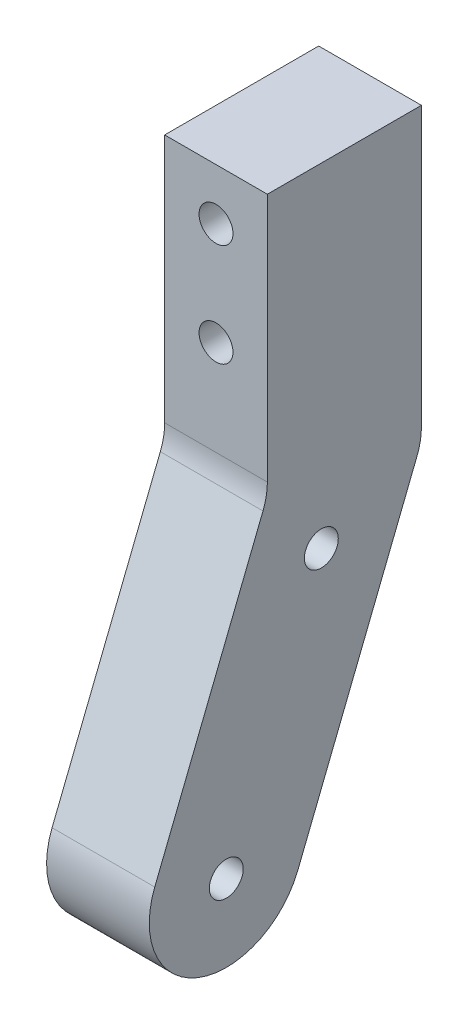
ISO-10303-21;
HEADER;
FILE_DESCRIPTION(('STEP AP214'),'2;1');
FILE_NAME('part.step','',(''),(''),'','','');
FILE_SCHEMA(('AUTOMOTIVE_DESIGN { 1 0 10303 214 1 1 1 1 }'));
ENDSEC;
DATA;
#1=APPLICATION_CONTEXT('core data for automotive mechanical design processes');
#2=APPLICATION_PROTOCOL_DEFINITION('international standard','automotive_design',2000,#1);
#3=PRODUCT_CONTEXT('',#1,'mechanical');
#4=PRODUCT('Part','Part','',(#3));
#5=PRODUCT_RELATED_PRODUCT_CATEGORY('part','',(#4));
#6=PRODUCT_DEFINITION_FORMATION('','',#4);
#7=PRODUCT_DEFINITION_CONTEXT('part definition',#1,'design');
#8=PRODUCT_DEFINITION('design','',#6,#7);
#9=PRODUCT_DEFINITION_SHAPE('','',#8);
#10=(LENGTH_UNIT() NAMED_UNIT(*) SI_UNIT(.MILLI.,.METRE.));
#11=(NAMED_UNIT(*) PLANE_ANGLE_UNIT() SI_UNIT($,.RADIAN.));
#12=(NAMED_UNIT(*) SI_UNIT($,.STERADIAN.) SOLID_ANGLE_UNIT());
#13=UNCERTAINTY_MEASURE_WITH_UNIT(LENGTH_MEASURE(1.E-05),#10,'distance_accuracy_value','');
#14=(GEOMETRIC_REPRESENTATION_CONTEXT(3) GLOBAL_UNCERTAINTY_ASSIGNED_CONTEXT((#13)) GLOBAL_UNIT_ASSIGNED_CONTEXT((#10,
#11,#12)) REPRESENTATION_CONTEXT('',''));
#15=CARTESIAN_POINT('',(0.,0.,0.));
#16=DIRECTION('',(0.,0.,1.));
#17=DIRECTION('',(1.,0.,0.));
#18=AXIS2_PLACEMENT_3D('',#15,#16,#17);
#19=CARTESIAN_POINT('',(10.,0.,0.));
#20=DIRECTION('',(-1.,0.,0.));
#21=DIRECTION('',(0.,0.,1.));
#22=AXIS2_PLACEMENT_3D('',#19,#20,#21);
#23=PLANE('',#22);
#24=CARTESIAN_POINT('',(10.,-23.2234711307508,9.25582998110832));
#25=DIRECTION('',(1.,0.,0.));
#26=DIRECTION('',(0.,0.,-1.));
#27=AXIS2_PLACEMENT_3D('',#24,#25,#26);
#28=CIRCLE('',#27,1.65);
#29=CARTESIAN_POINT('',(10.,-23.2234711307508,7.60582998110832));
#30=VERTEX_POINT('',#29);
#31=EDGE_CURVE('E194',#30,#30,#28,.T.);
#32=ORIENTED_EDGE('',*,*,#31,.F.);
#33=EDGE_LOOP('',(#32));
#34=FACE_BOUND('',#33,.T.);
#35=CARTESIAN_POINT('',(10.,0.,0.));
#36=DIRECTION('',(1.,0.,0.));
#37=DIRECTION('',(0.,0.,-1.));
#38=AXIS2_PLACEMENT_3D('',#35,#36,#37);
#39=CIRCLE('',#38,1.65);
#40=CARTESIAN_POINT('',(10.,0.,-1.65));
#41=VERTEX_POINT('',#40);
#42=EDGE_CURVE('E123',#41,#41,#39,.T.);
#43=ORIENTED_EDGE('',*,*,#42,.F.);
#44=EDGE_LOOP('',(#43));
#45=FACE_BOUND('',#44,.T.);
#46=DIRECTION('',(0.,0.928938845230033,-0.370233199244333));
#47=VECTOR('',#46,1.);
#48=CARTESIAN_POINT('',(10.,-2.77674899433249,-6.96704133922524));
#49=LINE('',#48,#47);
#50=CARTESIAN_POINT('',(10.,-26.0002201250833,2.28878864188308));
#51=VERTEX_POINT('',#50);
#52=CARTESIAN_POINT('',(10.,3.12051037200447,-9.31742340493795));
#53=VERTEX_POINT('',#52);
#54=EDGE_CURVE('E207',#51,#53,#49,.T.);
#55=ORIENTED_EDGE('',*,*,#54,.T.);
#56=CARTESIAN_POINT('',(10.,5.34190956747047,-3.74379033355775));
#57=DIRECTION('',(-1.,0.,0.));
#58=DIRECTION('',(0.,0.,1.));
#59=AXIS2_PLACEMENT_3D('',#56,#57,#58);
#60=CIRCLE('',#59,6.);
#61=CARTESIAN_POINT('',(10.,5.34190956747047,-9.74379033355775));
#62=VERTEX_POINT('',#61);
#63=EDGE_CURVE('E142',#53,#62,#60,.F.);
#64=ORIENTED_EDGE('',*,*,#63,.T.);
#65=DIRECTION('',(0.,1.,0.));
#66=VECTOR('',#65,1.);
#67=CARTESIAN_POINT('',(10.,0.,-9.74379033355775));
#68=LINE('',#67,#66);
#69=CARTESIAN_POINT('',(10.,32.5,-9.74379033355775));
#70=VERTEX_POINT('',#69);
#71=EDGE_CURVE('E209',#62,#70,#68,.T.);
#72=ORIENTED_EDGE('',*,*,#71,.T.);
#73=DIRECTION('',(0.,0.,1.));
#74=VECTOR('',#73,1.);
#75=CARTESIAN_POINT('',(10.,32.5,32.2473639339157));
#76=LINE('',#75,#74);
#77=CARTESIAN_POINT('',(10.,32.5,5.25620966644225));
#78=VERTEX_POINT('',#77);
#79=EDGE_CURVE('E122',#70,#78,#76,.T.);
#80=ORIENTED_EDGE('',*,*,#79,.T.);
#81=DIRECTION('',(0.,1.,0.));
#82=VECTOR('',#81,1.);
#83=CARTESIAN_POINT('',(10.,0.,5.25620966644224));
#84=LINE('',#83,#82);
#85=CARTESIAN_POINT('',(10.,8.22095262391465,5.25620966644224));
#86=VERTEX_POINT('',#85);
#87=EDGE_CURVE('E112',#86,#78,#84,.T.);
#88=ORIENTED_EDGE('',*,*,#87,.F.);
#89=CARTESIAN_POINT('',(10.,8.22095262391465,11.2562096664422));
#90=DIRECTION('',(-1.,0.,0.));
#91=DIRECTION('',(0.,0.,1.));
#92=AXIS2_PLACEMENT_3D('',#89,#90,#91);
#93=CIRCLE('',#92,6.);
#94=CARTESIAN_POINT('',(10.,5.99955342844866,5.68257659506205));
#95=VERTEX_POINT('',#94);
#96=EDGE_CURVE('E41',#86,#95,#93,.T.);
#97=ORIENTED_EDGE('',*,*,#96,.T.);
#98=DIRECTION('',(0.,0.928938845230033,-0.370233199244332));
#99=VECTOR('',#98,1.);
#100=CARTESIAN_POINT('',(10.,2.77674899433249,6.96704133922524));
#101=LINE('',#100,#99);
#102=CARTESIAN_POINT('',(10.,-20.4467221364183,16.2228713203335));
#103=VERTEX_POINT('',#102);
#104=EDGE_CURVE('E139',#103,#95,#101,.T.);
#105=ORIENTED_EDGE('',*,*,#104,.F.);
#106=CARTESIAN_POINT('',(10.,-23.2234711307508,9.25582998110832));
#107=DIRECTION('',(1.,0.,0.));
#108=DIRECTION('',(0.,0.,-1.));
#109=AXIS2_PLACEMENT_3D('',#106,#107,#108);
#110=CIRCLE('',#109,7.5);
#111=EDGE_CURVE('E205',#103,#51,#110,.T.);
#112=ORIENTED_EDGE('',*,*,#111,.T.);
#113=EDGE_LOOP('',(#55,#64,#72,#80,#88,#97,#105,#112));
#114=FACE_BOUND('',#113,.T.);
#115=ADVANCED_FACE('F33',(#34,#45,#114),#23,.F.);
#116=CARTESIAN_POINT('',(0.,0.,0.));
#117=DIRECTION('',(-1.,0.,0.));
#118=DIRECTION('',(0.,0.,1.));
#119=AXIS2_PLACEMENT_3D('',#116,#117,#118);
#120=PLANE('',#119);
#121=CARTESIAN_POINT('',(0.,0.,0.));
#122=DIRECTION('',(1.,0.,0.));
#123=DIRECTION('',(0.,0.,-1.));
#124=AXIS2_PLACEMENT_3D('',#121,#122,#123);
#125=CIRCLE('',#124,1.65);
#126=CARTESIAN_POINT('',(0.,0.,-1.65));
#127=VERTEX_POINT('',#126);
#128=EDGE_CURVE('E128',#127,#127,#125,.T.);
#129=ORIENTED_EDGE('',*,*,#128,.T.);
#130=EDGE_LOOP('',(#129));
#131=FACE_BOUND('',#130,.T.);
#132=CARTESIAN_POINT('',(0.,-23.2234711307508,9.25582998110832));
#133=DIRECTION('',(1.,0.,0.));
#134=DIRECTION('',(0.,0.,-1.));
#135=AXIS2_PLACEMENT_3D('',#132,#133,#134);
#136=CIRCLE('',#135,1.65);
#137=CARTESIAN_POINT('',(0.,-23.2234711307508,7.60582998110832));
#138=VERTEX_POINT('',#137);
#139=EDGE_CURVE('E196',#138,#138,#136,.T.);
#140=ORIENTED_EDGE('',*,*,#139,.T.);
#141=EDGE_LOOP('',(#140));
#142=FACE_BOUND('',#141,.T.);
#143=DIRECTION('',(0.,1.,0.));
#144=VECTOR('',#143,1.);
#145=CARTESIAN_POINT('',(0.,0.,-9.74379033355775));
#146=LINE('',#145,#144);
#147=CARTESIAN_POINT('',(0.,5.34190956747047,-9.74379033355775));
#148=VERTEX_POINT('',#147);
#149=CARTESIAN_POINT('',(0.,32.5,-9.74379033355775));
#150=VERTEX_POINT('',#149);
#151=EDGE_CURVE('E105',#148,#150,#146,.T.);
#152=ORIENTED_EDGE('',*,*,#151,.F.);
#153=CARTESIAN_POINT('',(0.,5.34190956747047,-3.74379033355775));
#154=DIRECTION('',(-1.,0.,0.));
#155=DIRECTION('',(0.,0.,1.));
#156=AXIS2_PLACEMENT_3D('',#153,#154,#155);
#157=CIRCLE('',#156,6.);
#158=CARTESIAN_POINT('',(0.,3.12051037200447,-9.31742340493795));
#159=VERTEX_POINT('',#158);
#160=EDGE_CURVE('E146',#148,#159,#157,.T.);
#161=ORIENTED_EDGE('',*,*,#160,.T.);
#162=DIRECTION('',(0.,0.928938845230033,-0.370233199244333));
#163=VECTOR('',#162,1.);
#164=CARTESIAN_POINT('',(0.,-2.77674899433249,-6.96704133922524));
#165=LINE('',#164,#163);
#166=CARTESIAN_POINT('',(0.,-26.0002201250833,2.28878864188308));
#167=VERTEX_POINT('',#166);
#168=EDGE_CURVE('E213',#167,#159,#165,.T.);
#169=ORIENTED_EDGE('',*,*,#168,.F.);
#170=CARTESIAN_POINT('',(0.,-23.2234711307508,9.25582998110832));
#171=DIRECTION('',(1.,0.,0.));
#172=DIRECTION('',(0.,0.,-1.));
#173=AXIS2_PLACEMENT_3D('',#170,#171,#172);
#174=CIRCLE('',#173,7.5);
#175=CARTESIAN_POINT('',(0.,-20.4467221364183,16.2228713203335));
#176=VERTEX_POINT('',#175);
#177=EDGE_CURVE('E117',#176,#167,#174,.T.);
#178=ORIENTED_EDGE('',*,*,#177,.F.);
#179=DIRECTION('',(0.,0.928938845230033,-0.370233199244332));
#180=VECTOR('',#179,1.);
#181=CARTESIAN_POINT('',(0.,2.77674899433249,6.96704133922524));
#182=LINE('',#181,#180);
#183=CARTESIAN_POINT('',(0.,5.99955342844866,5.68257659506205));
#184=VERTEX_POINT('',#183);
#185=EDGE_CURVE('E106',#176,#184,#182,.T.);
#186=ORIENTED_EDGE('',*,*,#185,.T.);
#187=CARTESIAN_POINT('',(0.,8.22095262391465,11.2562096664422));
#188=DIRECTION('',(-1.,0.,0.));
#189=DIRECTION('',(0.,0.,1.));
#190=AXIS2_PLACEMENT_3D('',#187,#188,#189);
#191=CIRCLE('',#190,6.);
#192=CARTESIAN_POINT('',(0.,8.22095262391465,5.25620966644224));
#193=VERTEX_POINT('',#192);
#194=EDGE_CURVE('E11',#184,#193,#191,.F.);
#195=ORIENTED_EDGE('',*,*,#194,.T.);
#196=DIRECTION('',(0.,1.,0.));
#197=VECTOR('',#196,1.);
#198=CARTESIAN_POINT('',(0.,0.,5.25620966644224));
#199=LINE('',#198,#197);
#200=CARTESIAN_POINT('',(0.,32.5,5.25620966644225));
#201=VERTEX_POINT('',#200);
#202=EDGE_CURVE('E96',#193,#201,#199,.T.);
#203=ORIENTED_EDGE('',*,*,#202,.T.);
#204=DIRECTION('',(0.,0.,1.));
#205=VECTOR('',#204,1.);
#206=CARTESIAN_POINT('',(0.,32.5,32.2473639339157));
#207=LINE('',#206,#205);
#208=EDGE_CURVE('E101',#150,#201,#207,.T.);
#209=ORIENTED_EDGE('',*,*,#208,.F.);
#210=EDGE_LOOP('',(#152,#161,#169,#178,#186,#195,#203,#209));
#211=FACE_BOUND('',#210,.T.);
#212=ADVANCED_FACE('F99',(#131,#142,#211),#120,.T.);
#213=CARTESIAN_POINT('',(10.,32.5,32.2473639339157));
#214=DIRECTION('',(0.,-1.,0.));
#215=DIRECTION('',(0.,0.,-1.));
#216=AXIS2_PLACEMENT_3D('',#213,#214,#215);
#217=PLANE('',#216);
#218=DIRECTION('',(1.,0.,0.));
#219=VECTOR('',#218,1.);
#220=CARTESIAN_POINT('',(0.,32.5,-9.74379033355775));
#221=LINE('',#220,#219);
#222=EDGE_CURVE('E116',#150,#70,#221,.T.);
#223=ORIENTED_EDGE('',*,*,#222,.F.);
#224=ORIENTED_EDGE('',*,*,#208,.T.);
#225=DIRECTION('',(1.,0.,0.));
#226=VECTOR('',#225,1.);
#227=CARTESIAN_POINT('',(0.,32.5,5.25620966644225));
#228=LINE('',#227,#226);
#229=EDGE_CURVE('E109',#201,#78,#228,.T.);
#230=ORIENTED_EDGE('',*,*,#229,.T.);
#231=ORIENTED_EDGE('',*,*,#79,.F.);
#232=EDGE_LOOP('',(#223,#224,#230,#231));
#233=FACE_BOUND('',#232,.T.);
#234=ADVANCED_FACE('F120',(#233),#217,.F.);
#235=CARTESIAN_POINT('',(10.,0.,0.));
#236=DIRECTION('',(-1.,0.,0.));
#237=DIRECTION('',(0.,0.,1.));
#238=AXIS2_PLACEMENT_3D('',#235,#236,#237);
#239=CYLINDRICAL_SURFACE('',#238,1.65);
#240=ORIENTED_EDGE('',*,*,#42,.T.);
#241=EDGE_LOOP('',(#240));
#242=FACE_BOUND('',#241,.T.);
#243=ORIENTED_EDGE('',*,*,#128,.F.);
#244=EDGE_LOOP('',(#243));
#245=FACE_BOUND('',#244,.T.);
#246=ADVANCED_FACE('F177',(#242,#245),#239,.F.);
#247=CARTESIAN_POINT('',(10.,-23.2234711307508,9.25582998110832));
#248=DIRECTION('',(-1.,0.,0.));
#249=DIRECTION('',(0.,0.,1.));
#250=AXIS2_PLACEMENT_3D('',#247,#248,#249);
#251=CYLINDRICAL_SURFACE('',#250,1.65);
#252=ORIENTED_EDGE('',*,*,#31,.T.);
#253=EDGE_LOOP('',(#252));
#254=FACE_BOUND('',#253,.T.);
#255=ORIENTED_EDGE('',*,*,#139,.F.);
#256=EDGE_LOOP('',(#255));
#257=FACE_BOUND('',#256,.T.);
#258=ADVANCED_FACE('F184',(#254,#257),#251,.F.);
#259=CARTESIAN_POINT('',(0.,2.77674899433249,6.96704133922524));
#260=DIRECTION('',(0.,-0.370233199244332,-0.928938845230033));
#261=DIRECTION('',(0.,0.928938845230033,-0.370233199244332));
#262=AXIS2_PLACEMENT_3D('',#259,#260,#261);
#263=PLANE('',#262);
#264=ORIENTED_EDGE('',*,*,#104,.T.);
#265=DIRECTION('',(1.,0.,0.));
#266=VECTOR('',#265,1.);
#267=CARTESIAN_POINT('',(0.,5.99955342844866,5.68257659506205));
#268=LINE('',#267,#266);
#269=EDGE_CURVE('E54',#95,#184,#268,.F.);
#270=ORIENTED_EDGE('',*,*,#269,.T.);
#271=ORIENTED_EDGE('',*,*,#185,.F.);
#272=DIRECTION('',(1.,0.,0.));
#273=VECTOR('',#272,1.);
#274=CARTESIAN_POINT('',(0.,-20.4467221364183,16.2228713203335));
#275=LINE('',#274,#273);
#276=EDGE_CURVE('E156',#176,#103,#275,.T.);
#277=ORIENTED_EDGE('',*,*,#276,.T.);
#278=EDGE_LOOP('',(#264,#270,#271,#277));
#279=FACE_BOUND('',#278,.T.);
#280=ADVANCED_FACE('F155',(#279),#263,.F.);
#281=CARTESIAN_POINT('',(0.,-23.2234711307508,9.25582998110832));
#282=DIRECTION('',(1.,0.,0.));
#283=DIRECTION('',(0.,0.,-1.));
#284=AXIS2_PLACEMENT_3D('',#281,#282,#283);
#285=CYLINDRICAL_SURFACE('',#284,7.5);
#286=ORIENTED_EDGE('',*,*,#111,.F.);
#287=ORIENTED_EDGE('',*,*,#276,.F.);
#288=ORIENTED_EDGE('',*,*,#177,.T.);
#289=DIRECTION('',(1.,0.,0.));
#290=VECTOR('',#289,1.);
#291=CARTESIAN_POINT('',(0.,-26.0002201250833,2.28878864188308));
#292=LINE('',#291,#290);
#293=EDGE_CURVE('E202',#167,#51,#292,.T.);
#294=ORIENTED_EDGE('',*,*,#293,.T.);
#295=EDGE_LOOP('',(#286,#287,#288,#294));
#296=FACE_BOUND('',#295,.T.);
#297=ADVANCED_FACE('F243',(#296),#285,.T.);
#298=CARTESIAN_POINT('',(0.,-2.77674899433249,-6.96704133922524));
#299=DIRECTION('',(0.,-0.370233199244333,-0.928938845230033));
#300=DIRECTION('',(0.,0.928938845230033,-0.370233199244333));
#301=AXIS2_PLACEMENT_3D('',#298,#299,#300);
#302=PLANE('',#301);
#303=ORIENTED_EDGE('',*,*,#168,.T.);
#304=DIRECTION('',(1.,0.,0.));
#305=VECTOR('',#304,1.);
#306=CARTESIAN_POINT('',(0.,3.12051037200447,-9.31742340493795));
#307=LINE('',#306,#305);
#308=EDGE_CURVE('E125',#159,#53,#307,.T.);
#309=ORIENTED_EDGE('',*,*,#308,.T.);
#310=ORIENTED_EDGE('',*,*,#54,.F.);
#311=ORIENTED_EDGE('',*,*,#293,.F.);
#312=EDGE_LOOP('',(#303,#309,#310,#311));
#313=FACE_BOUND('',#312,.T.);
#314=ADVANCED_FACE('F229',(#313),#302,.T.);
#315=CARTESIAN_POINT('',(0.,0.,-9.74379033355775));
#316=DIRECTION('',(0.,0.,-1.));
#317=DIRECTION('',(0.,1.,0.));
#318=AXIS2_PLACEMENT_3D('',#315,#316,#317);
#319=PLANE('',#318);
#320=CARTESIAN_POINT('',(5.,27.5,-9.74379033355775));
#321=DIRECTION('',(0.,0.,-1.));
#322=DIRECTION('',(0.,1.,0.));
#323=AXIS2_PLACEMENT_3D('',#320,#321,#322);
#324=CIRCLE('',#323,1.65);
#325=CARTESIAN_POINT('',(5.,29.15,-9.74379033355775));
#326=VERTEX_POINT('',#325);
#327=EDGE_CURVE('E136',#326,#326,#324,.T.);
#328=ORIENTED_EDGE('',*,*,#327,.F.);
#329=EDGE_LOOP('',(#328));
#330=FACE_BOUND('',#329,.T.);
#331=CARTESIAN_POINT('',(5.,17.5,-9.74379033355775));
#332=DIRECTION('',(0.,0.,-1.));
#333=DIRECTION('',(0.,1.,0.));
#334=AXIS2_PLACEMENT_3D('',#331,#332,#333);
#335=CIRCLE('',#334,1.65);
#336=CARTESIAN_POINT('',(5.,19.15,-9.74379033355775));
#337=VERTEX_POINT('',#336);
#338=EDGE_CURVE('E218',#337,#337,#335,.T.);
#339=ORIENTED_EDGE('',*,*,#338,.F.);
#340=EDGE_LOOP('',(#339));
#341=FACE_BOUND('',#340,.T.);
#342=ORIENTED_EDGE('',*,*,#71,.F.);
#343=DIRECTION('',(1.,0.,0.));
#344=VECTOR('',#343,1.);
#345=CARTESIAN_POINT('',(0.,5.34190956747047,-9.74379033355775));
#346=LINE('',#345,#344);
#347=EDGE_CURVE('E144',#62,#148,#346,.F.);
#348=ORIENTED_EDGE('',*,*,#347,.T.);
#349=ORIENTED_EDGE('',*,*,#151,.T.);
#350=ORIENTED_EDGE('',*,*,#222,.T.);
#351=EDGE_LOOP('',(#342,#348,#349,#350));
#352=FACE_BOUND('',#351,.T.);
#353=ADVANCED_FACE('F226',(#330,#341,#352),#319,.T.);
#354=CARTESIAN_POINT('',(0.,0.,5.25620966644224));
#355=DIRECTION('',(0.,0.,-1.));
#356=DIRECTION('',(0.,1.,0.));
#357=AXIS2_PLACEMENT_3D('',#354,#355,#356);
#358=PLANE('',#357);
#359=CARTESIAN_POINT('',(5.,27.5,5.25620966644224));
#360=DIRECTION('',(0.,0.,-1.));
#361=DIRECTION('',(0.,1.,0.));
#362=AXIS2_PLACEMENT_3D('',#359,#360,#361);
#363=CIRCLE('',#362,1.65);
#364=CARTESIAN_POINT('',(5.,29.15,5.25620966644224));
#365=VERTEX_POINT('',#364);
#366=EDGE_CURVE('E135',#365,#365,#363,.T.);
#367=ORIENTED_EDGE('',*,*,#366,.T.);
#368=EDGE_LOOP('',(#367));
#369=FACE_BOUND('',#368,.T.);
#370=CARTESIAN_POINT('',(5.,17.5,5.25620966644224));
#371=DIRECTION('',(0.,0.,-1.));
#372=DIRECTION('',(0.,1.,0.));
#373=AXIS2_PLACEMENT_3D('',#370,#371,#372);
#374=CIRCLE('',#373,1.65);
#375=CARTESIAN_POINT('',(5.,19.15,5.25620966644224));
#376=VERTEX_POINT('',#375);
#377=EDGE_CURVE('E132',#376,#376,#374,.T.);
#378=ORIENTED_EDGE('',*,*,#377,.T.);
#379=EDGE_LOOP('',(#378));
#380=FACE_BOUND('',#379,.T.);
#381=ORIENTED_EDGE('',*,*,#202,.F.);
#382=DIRECTION('',(1.,0.,0.));
#383=VECTOR('',#382,1.);
#384=CARTESIAN_POINT('',(10.,8.22095262391465,5.25620966644224));
#385=LINE('',#384,#383);
#386=EDGE_CURVE('E148',#193,#86,#385,.T.);
#387=ORIENTED_EDGE('',*,*,#386,.T.);
#388=ORIENTED_EDGE('',*,*,#87,.T.);
#389=ORIENTED_EDGE('',*,*,#229,.F.);
#390=EDGE_LOOP('',(#381,#387,#388,#389));
#391=FACE_BOUND('',#390,.T.);
#392=ADVANCED_FACE('F110',(#369,#380,#391),#358,.F.);
#393=CARTESIAN_POINT('',(5.,17.5,16.7558299811083));
#394=DIRECTION('',(0.,0.,-1.));
#395=DIRECTION('',(0.,1.,0.));
#396=AXIS2_PLACEMENT_3D('',#393,#394,#395);
#397=CYLINDRICAL_SURFACE('',#396,1.65);
#398=ORIENTED_EDGE('',*,*,#338,.T.);
#399=EDGE_LOOP('',(#398));
#400=FACE_BOUND('',#399,.T.);
#401=ORIENTED_EDGE('',*,*,#377,.F.);
#402=EDGE_LOOP('',(#401));
#403=FACE_BOUND('',#402,.T.);
#404=ADVANCED_FACE('F253',(#400,#403),#397,.F.);
#405=CARTESIAN_POINT('',(5.,27.5,16.7558299811083));
#406=DIRECTION('',(0.,0.,-1.));
#407=DIRECTION('',(0.,1.,0.));
#408=AXIS2_PLACEMENT_3D('',#405,#406,#407);
#409=CYLINDRICAL_SURFACE('',#408,1.65);
#410=ORIENTED_EDGE('',*,*,#327,.T.);
#411=EDGE_LOOP('',(#410));
#412=FACE_BOUND('',#411,.T.);
#413=ORIENTED_EDGE('',*,*,#366,.F.);
#414=EDGE_LOOP('',(#413));
#415=FACE_BOUND('',#414,.T.);
#416=ADVANCED_FACE('F164',(#412,#415),#409,.F.);
#417=CARTESIAN_POINT('',(0.,5.34190956747047,-3.74379033355775));
#418=DIRECTION('',(1.,0.,0.));
#419=DIRECTION('',(0.,0.,-1.));
#420=AXIS2_PLACEMENT_3D('',#417,#418,#419);
#421=CYLINDRICAL_SURFACE('',#420,6.);
#422=ORIENTED_EDGE('',*,*,#160,.F.);
#423=ORIENTED_EDGE('',*,*,#347,.F.);
#424=ORIENTED_EDGE('',*,*,#63,.F.);
#425=ORIENTED_EDGE('',*,*,#308,.F.);
#426=EDGE_LOOP('',(#422,#423,#424,#425));
#427=FACE_BOUND('',#426,.T.);
#428=ADVANCED_FACE('F160',(#427),#421,.T.);
#429=CARTESIAN_POINT('',(0.,8.22095262391465,11.2562096664422));
#430=DIRECTION('',(-1.,0.,0.));
#431=DIRECTION('',(0.,0.,1.));
#432=AXIS2_PLACEMENT_3D('',#429,#430,#431);
#433=CYLINDRICAL_SURFACE('',#432,6.);
#434=ORIENTED_EDGE('',*,*,#194,.F.);
#435=ORIENTED_EDGE('',*,*,#269,.F.);
#436=ORIENTED_EDGE('',*,*,#96,.F.);
#437=ORIENTED_EDGE('',*,*,#386,.F.);
#438=EDGE_LOOP('',(#434,#435,#436,#437));
#439=FACE_BOUND('',#438,.T.);
#440=ADVANCED_FACE('F35',(#439),#433,.F.);
#441=CLOSED_SHELL('',(#115,#212,#234,#246,#258,#280,#297,#314,#353,#392,#404,#416,#428,#440));
#442=MANIFOLD_SOLID_BREP('B2',#441);
#443=ADVANCED_BREP_SHAPE_REPRESENTATION('',(#18,#442),#14);
#444=SHAPE_DEFINITION_REPRESENTATION(#9,#443);
ENDSEC;
END-ISO-10303-21;
